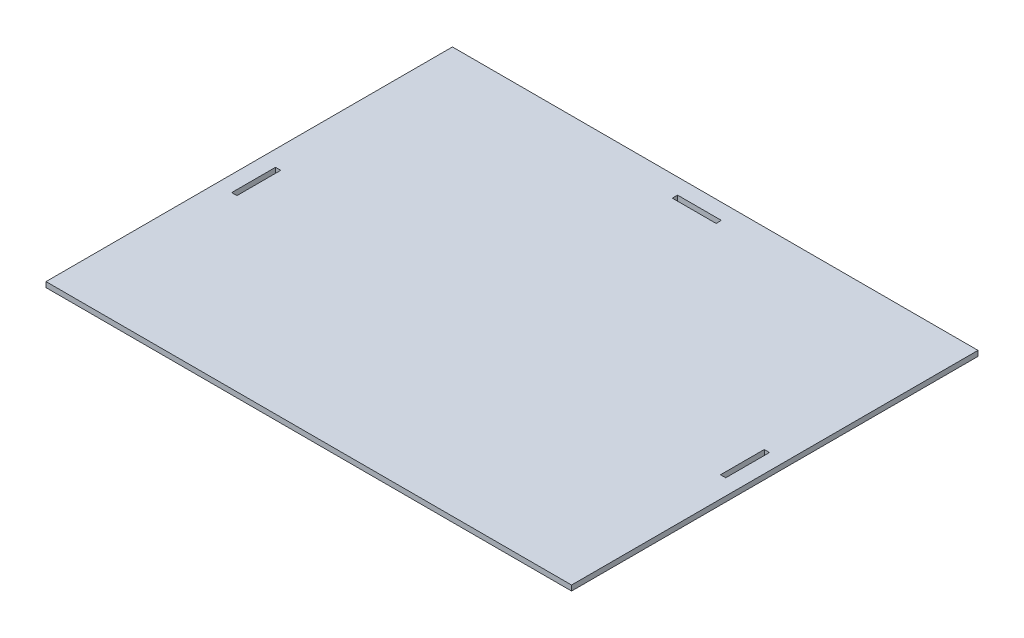
ISO-10303-21;
HEADER;
FILE_DESCRIPTION(('STEP AP214'),'2;1');
FILE_NAME('part.step','',(''),(''),'','','');
FILE_SCHEMA(('AUTOMOTIVE_DESIGN { 1 0 10303 214 1 1 1 1 }'));
ENDSEC;
DATA;
#1=APPLICATION_CONTEXT('core data for automotive mechanical design processes');
#2=APPLICATION_PROTOCOL_DEFINITION('international standard','automotive_design',2000,#1);
#3=PRODUCT_CONTEXT('',#1,'mechanical');
#4=PRODUCT('Part','Part','',(#3));
#5=PRODUCT_RELATED_PRODUCT_CATEGORY('part','',(#4));
#6=PRODUCT_DEFINITION_FORMATION('','',#4);
#7=PRODUCT_DEFINITION_CONTEXT('part definition',#1,'design');
#8=PRODUCT_DEFINITION('design','',#6,#7);
#9=PRODUCT_DEFINITION_SHAPE('','',#8);
#10=(LENGTH_UNIT() NAMED_UNIT(*) SI_UNIT(.MILLI.,.METRE.));
#11=(NAMED_UNIT(*) PLANE_ANGLE_UNIT() SI_UNIT($,.RADIAN.));
#12=(NAMED_UNIT(*) SI_UNIT($,.STERADIAN.) SOLID_ANGLE_UNIT());
#13=UNCERTAINTY_MEASURE_WITH_UNIT(LENGTH_MEASURE(1.E-05),#10,'distance_accuracy_value','');
#14=(GEOMETRIC_REPRESENTATION_CONTEXT(3) GLOBAL_UNCERTAINTY_ASSIGNED_CONTEXT((#13)) GLOBAL_UNIT_ASSIGNED_CONTEXT((#10,
#11,#12)) REPRESENTATION_CONTEXT('',''));
#15=CARTESIAN_POINT('',(0.,0.,0.));
#16=DIRECTION('',(0.,0.,1.));
#17=DIRECTION('',(1.,0.,0.));
#18=AXIS2_PLACEMENT_3D('',#15,#16,#17);
#19=CARTESIAN_POINT('',(0.,6.,0.));
#20=DIRECTION('',(0.,1.,0.));
#21=DIRECTION('',(0.,0.,1.));
#22=AXIS2_PLACEMENT_3D('',#19,#20,#21);
#23=PLANE('',#22);
#24=DIRECTION('',(0.,0.,1.));
#25=VECTOR('',#24,1.);
#26=CARTESIAN_POINT('',(0.,6.,0.));
#27=LINE('',#26,#25);
#28=CARTESIAN_POINT('',(0.,6.,0.));
#29=VERTEX_POINT('',#28);
#30=CARTESIAN_POINT('',(0.,6.,464.));
#31=VERTEX_POINT('',#30);
#32=EDGE_CURVE('E244',#29,#31,#27,.T.);
#33=ORIENTED_EDGE('',*,*,#32,.T.);
#34=DIRECTION('',(1.,0.,0.));
#35=VECTOR('',#34,1.);
#36=CARTESIAN_POINT('',(0.,6.,464.));
#37=LINE('',#36,#35);
#38=CARTESIAN_POINT('',(600.,6.,464.));
#39=VERTEX_POINT('',#38);
#40=EDGE_CURVE('E247',#31,#39,#37,.T.);
#41=ORIENTED_EDGE('',*,*,#40,.T.);
#42=DIRECTION('',(0.,0.,-1.));
#43=VECTOR('',#42,1.);
#44=CARTESIAN_POINT('',(600.,6.,0.));
#45=LINE('',#44,#43);
#46=CARTESIAN_POINT('',(600.,6.,0.));
#47=VERTEX_POINT('',#46);
#48=EDGE_CURVE('E250',#39,#47,#45,.T.);
#49=ORIENTED_EDGE('',*,*,#48,.T.);
#50=DIRECTION('',(-1.,0.,0.));
#51=VECTOR('',#50,1.);
#52=CARTESIAN_POINT('',(0.,6.,0.));
#53=LINE('',#52,#51);
#54=EDGE_CURVE('E252',#47,#29,#53,.T.);
#55=ORIENTED_EDGE('',*,*,#54,.T.);
#56=EDGE_LOOP('',(#33,#41,#49,#55));
#57=FACE_BOUND('',#56,.T.);
#58=DIRECTION('',(-1.,0.,0.));
#59=VECTOR('',#58,1.);
#60=CARTESIAN_POINT('',(275.,6.,18.));
#61=LINE('',#60,#59);
#62=CARTESIAN_POINT('',(325.,6.,18.));
#63=VERTEX_POINT('',#62);
#64=CARTESIAN_POINT('',(275.,6.,18.));
#65=VERTEX_POINT('',#64);
#66=EDGE_CURVE('E215',#63,#65,#61,.T.);
#67=ORIENTED_EDGE('',*,*,#66,.F.);
#68=DIRECTION('',(0.,0.,-1.));
#69=VECTOR('',#68,1.);
#70=CARTESIAN_POINT('',(325.,6.,18.));
#71=LINE('',#70,#69);
#72=CARTESIAN_POINT('',(325.,6.,24.));
#73=VERTEX_POINT('',#72);
#74=EDGE_CURVE('E213',#73,#63,#71,.T.);
#75=ORIENTED_EDGE('',*,*,#74,.F.);
#76=DIRECTION('',(1.,0.,0.));
#77=VECTOR('',#76,1.);
#78=CARTESIAN_POINT('',(275.,6.,24.));
#79=LINE('',#78,#77);
#80=CARTESIAN_POINT('',(275.,6.,24.));
#81=VERTEX_POINT('',#80);
#82=EDGE_CURVE('E221',#81,#73,#79,.T.);
#83=ORIENTED_EDGE('',*,*,#82,.F.);
#84=DIRECTION('',(0.,0.,1.));
#85=VECTOR('',#84,1.);
#86=CARTESIAN_POINT('',(275.,6.,18.));
#87=LINE('',#86,#85);
#88=EDGE_CURVE('E218',#65,#81,#87,.T.);
#89=ORIENTED_EDGE('',*,*,#88,.F.);
#90=EDGE_LOOP('',(#67,#75,#83,#89));
#91=FACE_BOUND('',#90,.T.);
#92=DIRECTION('',(-1.,0.,0.));
#93=VECTOR('',#92,1.);
#94=CARTESIAN_POINT('',(18.,6.,220.));
#95=LINE('',#94,#93);
#96=CARTESIAN_POINT('',(24.,6.,220.));
#97=VERTEX_POINT('',#96);
#98=CARTESIAN_POINT('',(18.,6.,220.));
#99=VERTEX_POINT('',#98);
#100=EDGE_CURVE('E184',#97,#99,#95,.T.);
#101=ORIENTED_EDGE('',*,*,#100,.F.);
#102=DIRECTION('',(0.,0.,-1.));
#103=VECTOR('',#102,1.);
#104=CARTESIAN_POINT('',(24.,6.,220.));
#105=LINE('',#104,#103);
#106=CARTESIAN_POINT('',(24.,6.,270.));
#107=VERTEX_POINT('',#106);
#108=EDGE_CURVE('E182',#107,#97,#105,.T.);
#109=ORIENTED_EDGE('',*,*,#108,.F.);
#110=DIRECTION('',(1.,0.,0.));
#111=VECTOR('',#110,1.);
#112=CARTESIAN_POINT('',(18.,6.,270.));
#113=LINE('',#112,#111);
#114=CARTESIAN_POINT('',(18.,6.,270.));
#115=VERTEX_POINT('',#114);
#116=EDGE_CURVE('E190',#115,#107,#113,.T.);
#117=ORIENTED_EDGE('',*,*,#116,.F.);
#118=DIRECTION('',(0.,0.,1.));
#119=VECTOR('',#118,1.);
#120=CARTESIAN_POINT('',(18.,6.,220.));
#121=LINE('',#120,#119);
#122=EDGE_CURVE('E187',#99,#115,#121,.T.);
#123=ORIENTED_EDGE('',*,*,#122,.F.);
#124=EDGE_LOOP('',(#101,#109,#117,#123));
#125=FACE_BOUND('',#124,.T.);
#126=DIRECTION('',(-1.,0.,0.));
#127=VECTOR('',#126,1.);
#128=CARTESIAN_POINT('',(582.,6.,220.));
#129=LINE('',#128,#127);
#130=CARTESIAN_POINT('',(582.,6.,220.));
#131=VERTEX_POINT('',#130);
#132=CARTESIAN_POINT('',(576.,6.,220.));
#133=VERTEX_POINT('',#132);
#134=EDGE_CURVE('E154',#131,#133,#129,.T.);
#135=ORIENTED_EDGE('',*,*,#134,.F.);
#136=DIRECTION('',(0.,0.,-1.));
#137=VECTOR('',#136,1.);
#138=CARTESIAN_POINT('',(582.,6.,220.));
#139=LINE('',#138,#137);
#140=CARTESIAN_POINT('',(582.,6.,270.));
#141=VERTEX_POINT('',#140);
#142=EDGE_CURVE('E146',#141,#131,#139,.T.);
#143=ORIENTED_EDGE('',*,*,#142,.F.);
#144=DIRECTION('',(1.,0.,0.));
#145=VECTOR('',#144,1.);
#146=CARTESIAN_POINT('',(582.,6.,270.));
#147=LINE('',#146,#145);
#148=CARTESIAN_POINT('',(576.,6.,270.));
#149=VERTEX_POINT('',#148);
#150=EDGE_CURVE('E168',#149,#141,#147,.T.);
#151=ORIENTED_EDGE('',*,*,#150,.F.);
#152=DIRECTION('',(0.,0.,1.));
#153=VECTOR('',#152,1.);
#154=CARTESIAN_POINT('',(576.,6.,220.));
#155=LINE('',#154,#153);
#156=EDGE_CURVE('E166',#133,#149,#155,.T.);
#157=ORIENTED_EDGE('',*,*,#156,.F.);
#158=EDGE_LOOP('',(#135,#143,#151,#157));
#159=FACE_BOUND('',#158,.T.);
#160=ADVANCED_FACE('F33',(#57,#91,#125,#159),#23,.T.);
#161=CARTESIAN_POINT('',(0.,0.,0.));
#162=DIRECTION('',(0.,1.,0.));
#163=DIRECTION('',(0.,0.,1.));
#164=AXIS2_PLACEMENT_3D('',#161,#162,#163);
#165=PLANE('',#164);
#166=DIRECTION('',(0.,0.,-1.));
#167=VECTOR('',#166,1.);
#168=CARTESIAN_POINT('',(24.,0.,220.));
#169=LINE('',#168,#167);
#170=CARTESIAN_POINT('',(24.,0.,270.));
#171=VERTEX_POINT('',#170);
#172=CARTESIAN_POINT('',(24.,0.,220.));
#173=VERTEX_POINT('',#172);
#174=EDGE_CURVE('E162',#171,#173,#169,.T.);
#175=ORIENTED_EDGE('',*,*,#174,.T.);
#176=DIRECTION('',(-1.,0.,0.));
#177=VECTOR('',#176,1.);
#178=CARTESIAN_POINT('',(18.,0.,220.));
#179=LINE('',#178,#177);
#180=CARTESIAN_POINT('',(18.,0.,220.));
#181=VERTEX_POINT('',#180);
#182=EDGE_CURVE('E195',#173,#181,#179,.T.);
#183=ORIENTED_EDGE('',*,*,#182,.T.);
#184=DIRECTION('',(0.,0.,1.));
#185=VECTOR('',#184,1.);
#186=CARTESIAN_POINT('',(18.,0.,220.));
#187=LINE('',#186,#185);
#188=CARTESIAN_POINT('',(18.,0.,270.));
#189=VERTEX_POINT('',#188);
#190=EDGE_CURVE('E198',#181,#189,#187,.T.);
#191=ORIENTED_EDGE('',*,*,#190,.T.);
#192=DIRECTION('',(1.,0.,0.));
#193=VECTOR('',#192,1.);
#194=CARTESIAN_POINT('',(18.,0.,270.));
#195=LINE('',#194,#193);
#196=EDGE_CURVE('E185',#189,#171,#195,.T.);
#197=ORIENTED_EDGE('',*,*,#196,.T.);
#198=EDGE_LOOP('',(#175,#183,#191,#197));
#199=FACE_BOUND('',#198,.T.);
#200=DIRECTION('',(0.,0.,1.));
#201=VECTOR('',#200,1.);
#202=CARTESIAN_POINT('',(0.,0.,0.));
#203=LINE('',#202,#201);
#204=CARTESIAN_POINT('',(0.,0.,0.));
#205=VERTEX_POINT('',#204);
#206=CARTESIAN_POINT('',(0.,0.,464.));
#207=VERTEX_POINT('',#206);
#208=EDGE_CURVE('E243',#205,#207,#203,.T.);
#209=ORIENTED_EDGE('',*,*,#208,.F.);
#210=DIRECTION('',(-1.,0.,0.));
#211=VECTOR('',#210,1.);
#212=CARTESIAN_POINT('',(0.,0.,0.));
#213=LINE('',#212,#211);
#214=CARTESIAN_POINT('',(600.,0.,0.));
#215=VERTEX_POINT('',#214);
#216=EDGE_CURVE('E248',#215,#205,#213,.T.);
#217=ORIENTED_EDGE('',*,*,#216,.F.);
#218=DIRECTION('',(0.,0.,-1.));
#219=VECTOR('',#218,1.);
#220=CARTESIAN_POINT('',(600.,0.,0.));
#221=LINE('',#220,#219);
#222=CARTESIAN_POINT('',(600.,0.,464.));
#223=VERTEX_POINT('',#222);
#224=EDGE_CURVE('E259',#223,#215,#221,.T.);
#225=ORIENTED_EDGE('',*,*,#224,.F.);
#226=DIRECTION('',(1.,0.,0.));
#227=VECTOR('',#226,1.);
#228=CARTESIAN_POINT('',(307.,0.,464.));
#229=LINE('',#228,#227);
#230=EDGE_CURVE('E257',#207,#223,#229,.T.);
#231=ORIENTED_EDGE('',*,*,#230,.F.);
#232=EDGE_LOOP('',(#209,#217,#225,#231));
#233=FACE_BOUND('',#232,.T.);
#234=DIRECTION('',(0.,0.,-1.));
#235=VECTOR('',#234,1.);
#236=CARTESIAN_POINT('',(325.,0.,18.));
#237=LINE('',#236,#235);
#238=CARTESIAN_POINT('',(325.,0.,24.));
#239=VERTEX_POINT('',#238);
#240=CARTESIAN_POINT('',(325.,0.,18.));
#241=VERTEX_POINT('',#240);
#242=EDGE_CURVE('E212',#239,#241,#237,.T.);
#243=ORIENTED_EDGE('',*,*,#242,.T.);
#244=DIRECTION('',(-1.,0.,0.));
#245=VECTOR('',#244,1.);
#246=CARTESIAN_POINT('',(275.,0.,18.));
#247=LINE('',#246,#245);
#248=CARTESIAN_POINT('',(275.,0.,18.));
#249=VERTEX_POINT('',#248);
#250=EDGE_CURVE('E226',#241,#249,#247,.T.);
#251=ORIENTED_EDGE('',*,*,#250,.T.);
#252=DIRECTION('',(0.,0.,1.));
#253=VECTOR('',#252,1.);
#254=CARTESIAN_POINT('',(275.,0.,18.));
#255=LINE('',#254,#253);
#256=CARTESIAN_POINT('',(275.,0.,24.));
#257=VERTEX_POINT('',#256);
#258=EDGE_CURVE('E229',#249,#257,#255,.T.);
#259=ORIENTED_EDGE('',*,*,#258,.T.);
#260=DIRECTION('',(1.,0.,0.));
#261=VECTOR('',#260,1.);
#262=CARTESIAN_POINT('',(275.,0.,24.));
#263=LINE('',#262,#261);
#264=EDGE_CURVE('E216',#257,#239,#263,.T.);
#265=ORIENTED_EDGE('',*,*,#264,.T.);
#266=EDGE_LOOP('',(#243,#251,#259,#265));
#267=FACE_BOUND('',#266,.T.);
#268=DIRECTION('',(0.,0.,-1.));
#269=VECTOR('',#268,1.);
#270=CARTESIAN_POINT('',(582.,0.,220.));
#271=LINE('',#270,#269);
#272=CARTESIAN_POINT('',(582.,0.,270.));
#273=VERTEX_POINT('',#272);
#274=CARTESIAN_POINT('',(582.,0.,220.));
#275=VERTEX_POINT('',#274);
#276=EDGE_CURVE('E56',#273,#275,#271,.T.);
#277=ORIENTED_EDGE('',*,*,#276,.T.);
#278=DIRECTION('',(-1.,0.,0.));
#279=VECTOR('',#278,1.);
#280=CARTESIAN_POINT('',(582.,0.,220.));
#281=LINE('',#280,#279);
#282=CARTESIAN_POINT('',(576.,0.,220.));
#283=VERTEX_POINT('',#282);
#284=EDGE_CURVE('E161',#275,#283,#281,.T.);
#285=ORIENTED_EDGE('',*,*,#284,.T.);
#286=DIRECTION('',(0.,0.,1.));
#287=VECTOR('',#286,1.);
#288=CARTESIAN_POINT('',(576.,0.,220.));
#289=LINE('',#288,#287);
#290=CARTESIAN_POINT('',(576.,0.,270.));
#291=VERTEX_POINT('',#290);
#292=EDGE_CURVE('E174',#283,#291,#289,.T.);
#293=ORIENTED_EDGE('',*,*,#292,.T.);
#294=DIRECTION('',(1.,0.,0.));
#295=VECTOR('',#294,1.);
#296=CARTESIAN_POINT('',(582.,0.,270.));
#297=LINE('',#296,#295);
#298=EDGE_CURVE('E155',#291,#273,#297,.T.);
#299=ORIENTED_EDGE('',*,*,#298,.T.);
#300=EDGE_LOOP('',(#277,#285,#293,#299));
#301=FACE_BOUND('',#300,.T.);
#302=ADVANCED_FACE('F277',(#199,#233,#267,#301),#165,.F.);
#303=CARTESIAN_POINT('',(0.,6.,0.));
#304=DIRECTION('',(1.,0.,0.));
#305=DIRECTION('',(0.,0.,-1.));
#306=AXIS2_PLACEMENT_3D('',#303,#304,#305);
#307=PLANE('',#306);
#308=ORIENTED_EDGE('',*,*,#208,.T.);
#309=DIRECTION('',(0.,-1.,0.));
#310=VECTOR('',#309,1.);
#311=CARTESIAN_POINT('',(0.,6.,464.));
#312=LINE('',#311,#310);
#313=EDGE_CURVE('E11',#31,#207,#312,.T.);
#314=ORIENTED_EDGE('',*,*,#313,.F.);
#315=ORIENTED_EDGE('',*,*,#32,.F.);
#316=DIRECTION('',(0.,-1.,0.));
#317=VECTOR('',#316,1.);
#318=CARTESIAN_POINT('',(0.,6.,0.));
#319=LINE('',#318,#317);
#320=EDGE_CURVE('E254',#29,#205,#319,.T.);
#321=ORIENTED_EDGE('',*,*,#320,.T.);
#322=EDGE_LOOP('',(#308,#314,#315,#321));
#323=FACE_BOUND('',#322,.T.);
#324=ADVANCED_FACE('F35',(#323),#307,.F.);
#325=CARTESIAN_POINT('',(307.,6.,464.));
#326=DIRECTION('',(0.,0.,-1.));
#327=DIRECTION('',(-1.,0.,0.));
#328=AXIS2_PLACEMENT_3D('',#325,#326,#327);
#329=PLANE('',#328);
#330=ORIENTED_EDGE('',*,*,#230,.T.);
#331=DIRECTION('',(0.,-1.,0.));
#332=VECTOR('',#331,1.);
#333=CARTESIAN_POINT('',(600.,6.,464.));
#334=LINE('',#333,#332);
#335=EDGE_CURVE('E41',#39,#223,#334,.T.);
#336=ORIENTED_EDGE('',*,*,#335,.F.);
#337=ORIENTED_EDGE('',*,*,#40,.F.);
#338=ORIENTED_EDGE('',*,*,#313,.T.);
#339=EDGE_LOOP('',(#330,#336,#337,#338));
#340=FACE_BOUND('',#339,.T.);
#341=ADVANCED_FACE('F288',(#340),#329,.F.);
#342=CARTESIAN_POINT('',(600.,6.,0.));
#343=DIRECTION('',(-1.,0.,0.));
#344=DIRECTION('',(0.,0.,1.));
#345=AXIS2_PLACEMENT_3D('',#342,#343,#344);
#346=PLANE('',#345);
#347=ORIENTED_EDGE('',*,*,#224,.T.);
#348=DIRECTION('',(0.,-1.,0.));
#349=VECTOR('',#348,1.);
#350=CARTESIAN_POINT('',(600.,6.,0.));
#351=LINE('',#350,#349);
#352=EDGE_CURVE('E264',#47,#215,#351,.T.);
#353=ORIENTED_EDGE('',*,*,#352,.F.);
#354=ORIENTED_EDGE('',*,*,#48,.F.);
#355=ORIENTED_EDGE('',*,*,#335,.T.);
#356=EDGE_LOOP('',(#347,#353,#354,#355));
#357=FACE_BOUND('',#356,.T.);
#358=ADVANCED_FACE('F271',(#357),#346,.F.);
#359=CARTESIAN_POINT('',(0.,6.,0.));
#360=DIRECTION('',(0.,0.,1.));
#361=DIRECTION('',(1.,0.,0.));
#362=AXIS2_PLACEMENT_3D('',#359,#360,#361);
#363=PLANE('',#362);
#364=ORIENTED_EDGE('',*,*,#216,.T.);
#365=ORIENTED_EDGE('',*,*,#320,.F.);
#366=ORIENTED_EDGE('',*,*,#54,.F.);
#367=ORIENTED_EDGE('',*,*,#352,.T.);
#368=EDGE_LOOP('',(#364,#365,#366,#367));
#369=FACE_BOUND('',#368,.T.);
#370=ADVANCED_FACE('F281',(#369),#363,.F.);
#371=CARTESIAN_POINT('',(325.,6.,18.));
#372=DIRECTION('',(-1.,0.,0.));
#373=DIRECTION('',(0.,0.,1.));
#374=AXIS2_PLACEMENT_3D('',#371,#372,#373);
#375=PLANE('',#374);
#376=ORIENTED_EDGE('',*,*,#242,.F.);
#377=DIRECTION('',(0.,-1.,0.));
#378=VECTOR('',#377,1.);
#379=CARTESIAN_POINT('',(325.,6.,24.));
#380=LINE('',#379,#378);
#381=EDGE_CURVE('E223',#73,#239,#380,.T.);
#382=ORIENTED_EDGE('',*,*,#381,.F.);
#383=ORIENTED_EDGE('',*,*,#74,.T.);
#384=DIRECTION('',(0.,-1.,0.));
#385=VECTOR('',#384,1.);
#386=CARTESIAN_POINT('',(325.,6.,18.));
#387=LINE('',#386,#385);
#388=EDGE_CURVE('E240',#63,#241,#387,.T.);
#389=ORIENTED_EDGE('',*,*,#388,.T.);
#390=EDGE_LOOP('',(#376,#382,#383,#389));
#391=FACE_BOUND('',#390,.T.);
#392=ADVANCED_FACE('F303',(#391),#375,.T.);
#393=CARTESIAN_POINT('',(275.,6.,18.));
#394=DIRECTION('',(0.,0.,1.));
#395=DIRECTION('',(1.,0.,0.));
#396=AXIS2_PLACEMENT_3D('',#393,#394,#395);
#397=PLANE('',#396);
#398=ORIENTED_EDGE('',*,*,#250,.F.);
#399=ORIENTED_EDGE('',*,*,#388,.F.);
#400=ORIENTED_EDGE('',*,*,#66,.T.);
#401=DIRECTION('',(0.,-1.,0.));
#402=VECTOR('',#401,1.);
#403=CARTESIAN_POINT('',(275.,6.,18.));
#404=LINE('',#403,#402);
#405=EDGE_CURVE('E238',#65,#249,#404,.T.);
#406=ORIENTED_EDGE('',*,*,#405,.T.);
#407=EDGE_LOOP('',(#398,#399,#400,#406));
#408=FACE_BOUND('',#407,.T.);
#409=ADVANCED_FACE('F310',(#408),#397,.T.);
#410=CARTESIAN_POINT('',(275.,6.,18.));
#411=DIRECTION('',(1.,0.,0.));
#412=DIRECTION('',(0.,0.,-1.));
#413=AXIS2_PLACEMENT_3D('',#410,#411,#412);
#414=PLANE('',#413);
#415=ORIENTED_EDGE('',*,*,#258,.F.);
#416=ORIENTED_EDGE('',*,*,#405,.F.);
#417=ORIENTED_EDGE('',*,*,#88,.T.);
#418=DIRECTION('',(0.,-1.,0.));
#419=VECTOR('',#418,1.);
#420=CARTESIAN_POINT('',(275.,6.,24.));
#421=LINE('',#420,#419);
#422=EDGE_CURVE('E236',#81,#257,#421,.T.);
#423=ORIENTED_EDGE('',*,*,#422,.T.);
#424=EDGE_LOOP('',(#415,#416,#417,#423));
#425=FACE_BOUND('',#424,.T.);
#426=ADVANCED_FACE('F315',(#425),#414,.T.);
#427=CARTESIAN_POINT('',(275.,6.,24.));
#428=DIRECTION('',(0.,0.,-1.));
#429=DIRECTION('',(-1.,0.,0.));
#430=AXIS2_PLACEMENT_3D('',#427,#428,#429);
#431=PLANE('',#430);
#432=ORIENTED_EDGE('',*,*,#264,.F.);
#433=ORIENTED_EDGE('',*,*,#422,.F.);
#434=ORIENTED_EDGE('',*,*,#82,.T.);
#435=ORIENTED_EDGE('',*,*,#381,.T.);
#436=EDGE_LOOP('',(#432,#433,#434,#435));
#437=FACE_BOUND('',#436,.T.);
#438=ADVANCED_FACE('F322',(#437),#431,.T.);
#439=CARTESIAN_POINT('',(24.,6.,220.));
#440=DIRECTION('',(-1.,0.,0.));
#441=DIRECTION('',(0.,0.,1.));
#442=AXIS2_PLACEMENT_3D('',#439,#440,#441);
#443=PLANE('',#442);
#444=ORIENTED_EDGE('',*,*,#174,.F.);
#445=DIRECTION('',(0.,-1.,0.));
#446=VECTOR('',#445,1.);
#447=CARTESIAN_POINT('',(24.,6.,270.));
#448=LINE('',#447,#446);
#449=EDGE_CURVE('E192',#107,#171,#448,.T.);
#450=ORIENTED_EDGE('',*,*,#449,.F.);
#451=ORIENTED_EDGE('',*,*,#108,.T.);
#452=DIRECTION('',(0.,-1.,0.));
#453=VECTOR('',#452,1.);
#454=CARTESIAN_POINT('',(24.,6.,220.));
#455=LINE('',#454,#453);
#456=EDGE_CURVE('E209',#97,#173,#455,.T.);
#457=ORIENTED_EDGE('',*,*,#456,.T.);
#458=EDGE_LOOP('',(#444,#450,#451,#457));
#459=FACE_BOUND('',#458,.T.);
#460=ADVANCED_FACE('F344',(#459),#443,.T.);
#461=CARTESIAN_POINT('',(18.,6.,220.));
#462=DIRECTION('',(0.,0.,1.));
#463=DIRECTION('',(1.,0.,0.));
#464=AXIS2_PLACEMENT_3D('',#461,#462,#463);
#465=PLANE('',#464);
#466=ORIENTED_EDGE('',*,*,#182,.F.);
#467=ORIENTED_EDGE('',*,*,#456,.F.);
#468=ORIENTED_EDGE('',*,*,#100,.T.);
#469=DIRECTION('',(0.,-1.,0.));
#470=VECTOR('',#469,1.);
#471=CARTESIAN_POINT('',(18.,6.,220.));
#472=LINE('',#471,#470);
#473=EDGE_CURVE('E207',#99,#181,#472,.T.);
#474=ORIENTED_EDGE('',*,*,#473,.T.);
#475=EDGE_LOOP('',(#466,#467,#468,#474));
#476=FACE_BOUND('',#475,.T.);
#477=ADVANCED_FACE('F338',(#476),#465,.T.);
#478=CARTESIAN_POINT('',(18.,6.,220.));
#479=DIRECTION('',(1.,0.,0.));
#480=DIRECTION('',(0.,0.,-1.));
#481=AXIS2_PLACEMENT_3D('',#478,#479,#480);
#482=PLANE('',#481);
#483=ORIENTED_EDGE('',*,*,#190,.F.);
#484=ORIENTED_EDGE('',*,*,#473,.F.);
#485=ORIENTED_EDGE('',*,*,#122,.T.);
#486=DIRECTION('',(0.,-1.,0.));
#487=VECTOR('',#486,1.);
#488=CARTESIAN_POINT('',(18.,6.,270.));
#489=LINE('',#488,#487);
#490=EDGE_CURVE('E205',#115,#189,#489,.T.);
#491=ORIENTED_EDGE('',*,*,#490,.T.);
#492=EDGE_LOOP('',(#483,#484,#485,#491));
#493=FACE_BOUND('',#492,.T.);
#494=ADVANCED_FACE('F341',(#493),#482,.T.);
#495=CARTESIAN_POINT('',(18.,6.,270.));
#496=DIRECTION('',(0.,0.,-1.));
#497=DIRECTION('',(-1.,0.,0.));
#498=AXIS2_PLACEMENT_3D('',#495,#496,#497);
#499=PLANE('',#498);
#500=ORIENTED_EDGE('',*,*,#196,.F.);
#501=ORIENTED_EDGE('',*,*,#490,.F.);
#502=ORIENTED_EDGE('',*,*,#116,.T.);
#503=ORIENTED_EDGE('',*,*,#449,.T.);
#504=EDGE_LOOP('',(#500,#501,#502,#503));
#505=FACE_BOUND('',#504,.T.);
#506=ADVANCED_FACE('F347',(#505),#499,.T.);
#507=CARTESIAN_POINT('',(582.,6.,220.));
#508=DIRECTION('',(-1.,0.,0.));
#509=DIRECTION('',(0.,0.,1.));
#510=AXIS2_PLACEMENT_3D('',#507,#508,#509);
#511=PLANE('',#510);
#512=ORIENTED_EDGE('',*,*,#276,.F.);
#513=DIRECTION('',(0.,-1.,0.));
#514=VECTOR('',#513,1.);
#515=CARTESIAN_POINT('',(582.,6.,270.));
#516=LINE('',#515,#514);
#517=EDGE_CURVE('E150',#141,#273,#516,.T.);
#518=ORIENTED_EDGE('',*,*,#517,.F.);
#519=ORIENTED_EDGE('',*,*,#142,.T.);
#520=DIRECTION('',(0.,-1.,0.));
#521=VECTOR('',#520,1.);
#522=CARTESIAN_POINT('',(582.,6.,220.));
#523=LINE('',#522,#521);
#524=EDGE_CURVE('E149',#131,#275,#523,.T.);
#525=ORIENTED_EDGE('',*,*,#524,.T.);
#526=EDGE_LOOP('',(#512,#518,#519,#525));
#527=FACE_BOUND('',#526,.T.);
#528=ADVANCED_FACE('F148',(#527),#511,.T.);
#529=CARTESIAN_POINT('',(582.,6.,220.));
#530=DIRECTION('',(0.,0.,1.));
#531=DIRECTION('',(1.,0.,0.));
#532=AXIS2_PLACEMENT_3D('',#529,#530,#531);
#533=PLANE('',#532);
#534=ORIENTED_EDGE('',*,*,#284,.F.);
#535=ORIENTED_EDGE('',*,*,#524,.F.);
#536=ORIENTED_EDGE('',*,*,#134,.T.);
#537=DIRECTION('',(0.,-1.,0.));
#538=VECTOR('',#537,1.);
#539=CARTESIAN_POINT('',(576.,6.,220.));
#540=LINE('',#539,#538);
#541=EDGE_CURVE('E163',#133,#283,#540,.T.);
#542=ORIENTED_EDGE('',*,*,#541,.T.);
#543=EDGE_LOOP('',(#534,#535,#536,#542));
#544=FACE_BOUND('',#543,.T.);
#545=ADVANCED_FACE('F158',(#544),#533,.T.);
#546=CARTESIAN_POINT('',(576.,6.,220.));
#547=DIRECTION('',(1.,0.,0.));
#548=DIRECTION('',(0.,0.,-1.));
#549=AXIS2_PLACEMENT_3D('',#546,#547,#548);
#550=PLANE('',#549);
#551=ORIENTED_EDGE('',*,*,#292,.F.);
#552=ORIENTED_EDGE('',*,*,#541,.F.);
#553=ORIENTED_EDGE('',*,*,#156,.T.);
#554=DIRECTION('',(0.,-1.,0.));
#555=VECTOR('',#554,1.);
#556=CARTESIAN_POINT('',(576.,6.,270.));
#557=LINE('',#556,#555);
#558=EDGE_CURVE('E48',#149,#291,#557,.T.);
#559=ORIENTED_EDGE('',*,*,#558,.T.);
#560=EDGE_LOOP('',(#551,#552,#553,#559));
#561=FACE_BOUND('',#560,.T.);
#562=ADVANCED_FACE('F404',(#561),#550,.T.);
#563=CARTESIAN_POINT('',(582.,6.,270.));
#564=DIRECTION('',(0.,0.,-1.));
#565=DIRECTION('',(-1.,0.,0.));
#566=AXIS2_PLACEMENT_3D('',#563,#564,#565);
#567=PLANE('',#566);
#568=ORIENTED_EDGE('',*,*,#298,.F.);
#569=ORIENTED_EDGE('',*,*,#558,.F.);
#570=ORIENTED_EDGE('',*,*,#150,.T.);
#571=ORIENTED_EDGE('',*,*,#517,.T.);
#572=EDGE_LOOP('',(#568,#569,#570,#571));
#573=FACE_BOUND('',#572,.T.);
#574=ADVANCED_FACE('F412',(#573),#567,.T.);
#575=CLOSED_SHELL('',(#160,#302,#324,#341,#358,#370,#392,#409,#426,#438,#460,#477,#494,#506,
#528,#545,#562,#574));
#576=MANIFOLD_SOLID_BREP('B2',#575);
#577=ADVANCED_BREP_SHAPE_REPRESENTATION('',(#18,#576),#14);
#578=SHAPE_DEFINITION_REPRESENTATION(#9,#577);
ENDSEC;
END-ISO-10303-21;
